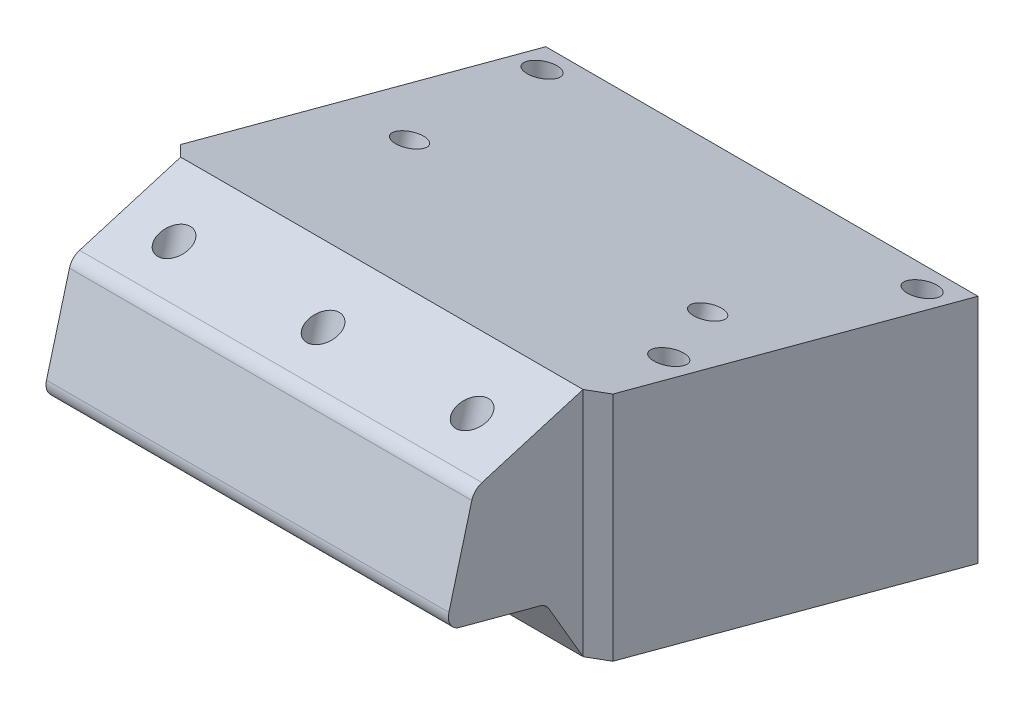
ISO-10303-21;
HEADER;
FILE_DESCRIPTION(('STEP AP214'),'2;1');
FILE_NAME('part.step','',(''),(''),'','','');
FILE_SCHEMA(('AUTOMOTIVE_DESIGN { 1 0 10303 214 1 1 1 1 }'));
ENDSEC;
DATA;
#1=APPLICATION_CONTEXT('core data for automotive mechanical design processes');
#2=APPLICATION_PROTOCOL_DEFINITION('international standard','automotive_design',2000,#1);
#3=PRODUCT_CONTEXT('',#1,'mechanical');
#4=PRODUCT('Part','Part','',(#3));
#5=PRODUCT_RELATED_PRODUCT_CATEGORY('part','',(#4));
#6=PRODUCT_DEFINITION_FORMATION('','',#4);
#7=PRODUCT_DEFINITION_CONTEXT('part definition',#1,'design');
#8=PRODUCT_DEFINITION('design','',#6,#7);
#9=PRODUCT_DEFINITION_SHAPE('','',#8);
#10=(LENGTH_UNIT() NAMED_UNIT(*) SI_UNIT(.MILLI.,.METRE.));
#11=(NAMED_UNIT(*) PLANE_ANGLE_UNIT() SI_UNIT($,.RADIAN.));
#12=(NAMED_UNIT(*) SI_UNIT($,.STERADIAN.) SOLID_ANGLE_UNIT());
#13=UNCERTAINTY_MEASURE_WITH_UNIT(LENGTH_MEASURE(1.E-05),#10,'distance_accuracy_value','');
#14=(GEOMETRIC_REPRESENTATION_CONTEXT(3) GLOBAL_UNCERTAINTY_ASSIGNED_CONTEXT((#13)) GLOBAL_UNIT_ASSIGNED_CONTEXT((#10,
#11,#12)) REPRESENTATION_CONTEXT('',''));
#15=CARTESIAN_POINT('',(0.,0.,0.));
#16=DIRECTION('',(0.,0.,1.));
#17=DIRECTION('',(1.,0.,0.));
#18=AXIS2_PLACEMENT_3D('',#15,#16,#17);
#19=CARTESIAN_POINT('',(132.287127209133,-48.0443614894541,0.));
#20=DIRECTION('',(0.,-0.965925826289068,0.258819045102521));
#21=DIRECTION('',(0.,-0.258819045102521,-0.965925826289068));
#22=AXIS2_PLACEMENT_3D('',#19,#20,#21);
#23=PLANE('',#22);
#24=CARTESIAN_POINT('',(25.5,-44.6949965840651,12.5));
#25=DIRECTION('',(0.,-0.965925826289068,0.258819045102521));
#26=DIRECTION('',(0.,-0.258819045102521,-0.965925826289068));
#27=AXIS2_PLACEMENT_3D('',#24,#25,#26);
#28=ELLIPSE('',#27,2.07055236082016,1.99999999999999);
#29=CARTESIAN_POINT('',(25.5,-45.2308949689273,10.5));
#30=VERTEX_POINT('',#29);
#31=EDGE_CURVE('E461',#30,#30,#28,.T.);
#32=ORIENTED_EDGE('',*,*,#31,.T.);
#33=EDGE_LOOP('',(#32));
#34=FACE_BOUND('',#33,.T.);
#35=CARTESIAN_POINT('',(25.5,-53.8052691267232,-21.5));
#36=DIRECTION('',(0.,-0.965925826289068,0.258819045102521));
#37=DIRECTION('',(0.,-0.258819045102521,-0.965925826289068));
#38=AXIS2_PLACEMENT_3D('',#35,#36,#37);
#39=ELLIPSE('',#38,2.07055236082015,1.99999999999999);
#40=CARTESIAN_POINT('',(25.5,-54.3411675115855,-23.5));
#41=VERTEX_POINT('',#40);
#42=EDGE_CURVE('E456',#41,#41,#39,.T.);
#43=ORIENTED_EDGE('',*,*,#42,.T.);
#44=EDGE_LOOP('',(#43));
#45=FACE_BOUND('',#44,.T.);
#46=CARTESIAN_POINT('',(-25.5,-53.8052691267232,-21.5));
#47=DIRECTION('',(0.,-0.965925826289068,0.258819045102521));
#48=DIRECTION('',(0.,-0.258819045102521,-0.965925826289068));
#49=AXIS2_PLACEMENT_3D('',#46,#47,#48);
#50=ELLIPSE('',#49,2.07055236082015,1.99999999999999);
#51=CARTESIAN_POINT('',(-25.5,-54.3411675115855,-23.5));
#52=VERTEX_POINT('',#51);
#53=EDGE_CURVE('E455',#52,#52,#50,.T.);
#54=ORIENTED_EDGE('',*,*,#53,.T.);
#55=EDGE_LOOP('',(#54));
#56=FACE_BOUND('',#55,.T.);
#57=CARTESIAN_POINT('',(-20.,-47.5654278723015,1.78740459266618));
#58=DIRECTION('',(0.,0.965925826289068,-0.258819045102521));
#59=DIRECTION('',(0.,0.258819045102521,0.965925826289068));
#60=AXIS2_PLACEMENT_3D('',#57,#58,#59);
#61=CIRCLE('',#60,1.94999999999999);
#62=CARTESIAN_POINT('',(-20.,-47.0607307343516,3.67095995392986));
#63=VERTEX_POINT('',#62);
#64=EDGE_CURVE('E161',#63,#63,#61,.T.);
#65=ORIENTED_EDGE('',*,*,#64,.F.);
#66=EDGE_LOOP('',(#65));
#67=FACE_BOUND('',#66,.T.);
#68=CARTESIAN_POINT('',(20.,-47.5654278723015,1.78740459266619));
#69=DIRECTION('',(0.,0.965925826289068,-0.258819045102521));
#70=DIRECTION('',(0.,0.258819045102521,0.965925826289068));
#71=AXIS2_PLACEMENT_3D('',#68,#69,#70);
#72=CIRCLE('',#71,1.94999999999999);
#73=CARTESIAN_POINT('',(20.,-47.0607307343516,3.67095995392986));
#74=VERTEX_POINT('',#73);
#75=EDGE_CURVE('E160',#74,#74,#72,.T.);
#76=ORIENTED_EDGE('',*,*,#75,.F.);
#77=EDGE_LOOP('',(#76));
#78=FACE_BOUND('',#77,.T.);
#79=DIRECTION('',(-1.,0.,0.));
#80=VECTOR('',#79,1.);
#81=CARTESIAN_POINT('',(27.,-41.2116570824605,25.5));
#82=LINE('',#81,#80);
#83=CARTESIAN_POINT('',(27.,-41.2116570824605,25.5));
#84=VERTEX_POINT('',#83);
#85=CARTESIAN_POINT('',(-27.,-41.2116570824605,25.5));
#86=VERTEX_POINT('',#85);
#87=EDGE_CURVE('E439',#84,#86,#82,.T.);
#88=ORIENTED_EDGE('',*,*,#87,.F.);
#89=DIRECTION('',(0.694746590606865,-0.186156787897386,-0.694746590606866));
#90=VECTOR('',#89,1.);
#91=CARTESIAN_POINT('',(34.603201838766,-43.2489288750486,17.896798161234));
#92=LINE('',#91,#90);
#93=CARTESIAN_POINT('',(29.,-41.7475554673227,23.5));
#94=VERTEX_POINT('',#93);
#95=EDGE_CURVE('E591',#84,#94,#92,.T.);
#96=ORIENTED_EDGE('',*,*,#95,.T.);
#97=DIRECTION('',(0.,-0.258819045102521,-0.965925826289068));
#98=VECTOR('',#97,1.);
#99=CARTESIAN_POINT('',(29.,-51.5247293347402,-12.9889096276365));
#100=LINE('',#99,#98);
#101=CARTESIAN_POINT('',(29.,-54.8770658964477,-25.5));
#102=VERTEX_POINT('',#101);
#103=EDGE_CURVE('E302',#94,#102,#100,.T.);
#104=ORIENTED_EDGE('',*,*,#103,.T.);
#105=DIRECTION('',(-1.,0.,0.));
#106=VECTOR('',#105,1.);
#107=CARTESIAN_POINT('',(132.287127209133,-54.8770658964478,-25.5));
#108=LINE('',#107,#106);
#109=CARTESIAN_POINT('',(-29.,-54.8770658964477,-25.5));
#110=VERTEX_POINT('',#109);
#111=EDGE_CURVE('E296',#102,#110,#108,.T.);
#112=ORIENTED_EDGE('',*,*,#111,.T.);
#113=DIRECTION('',(0.,0.258819045102521,0.965925826289068));
#114=VECTOR('',#113,1.);
#115=CARTESIAN_POINT('',(-29.,-48.0443614894541,0.));
#116=LINE('',#115,#114);
#117=CARTESIAN_POINT('',(-29.,-41.7475554673227,23.5));
#118=VERTEX_POINT('',#117);
#119=EDGE_CURVE('E303',#110,#118,#116,.T.);
#120=ORIENTED_EDGE('',*,*,#119,.T.);
#121=DIRECTION('',(-0.694746590606865,-0.186156787897386,-0.694746590606866));
#122=VECTOR('',#121,1.);
#123=CARTESIAN_POINT('',(-36.5338931394054,-43.7662560498888,15.9661068605946));
#124=LINE('',#123,#122);
#125=EDGE_CURVE('E561',#118,#86,#124,.F.);
#126=ORIENTED_EDGE('',*,*,#125,.T.);
#127=EDGE_LOOP('',(#88,#96,#104,#112,#120,#126));
#128=FACE_BOUND('',#127,.T.);
#129=ADVANCED_FACE('F54',(#34,#45,#56,#67,#78,#128),#23,.F.);
#130=CARTESIAN_POINT('',(132.287127209133,-79.1026469017566,0.));
#131=DIRECTION('',(0.,-0.965925826289068,0.258819045102521));
#132=DIRECTION('',(0.,-0.258819045102521,-0.965925826289068));
#133=AXIS2_PLACEMENT_3D('',#130,#131,#132);
#134=PLANE('',#133);
#135=CARTESIAN_POINT('',(25.5,-75.7532819963676,12.5));
#136=DIRECTION('',(0.,-0.965925826289068,0.258819045102521));
#137=DIRECTION('',(0.,-0.258819045102521,-0.965925826289068));
#138=AXIS2_PLACEMENT_3D('',#135,#136,#137);
#139=ELLIPSE('',#138,2.07055236082016,1.99999999999999);
#140=CARTESIAN_POINT('',(25.5,-76.2891803812298,10.5));
#141=VERTEX_POINT('',#140);
#142=EDGE_CURVE('E462',#141,#141,#139,.T.);
#143=ORIENTED_EDGE('',*,*,#142,.F.);
#144=EDGE_LOOP('',(#143));
#145=FACE_BOUND('',#144,.T.);
#146=CARTESIAN_POINT('',(25.5,-84.8635545390257,-21.5));
#147=DIRECTION('',(0.,-0.965925826289068,0.258819045102521));
#148=DIRECTION('',(0.,-0.258819045102521,-0.965925826289068));
#149=AXIS2_PLACEMENT_3D('',#146,#147,#148);
#150=ELLIPSE('',#149,2.07055236082015,1.99999999999999);
#151=CARTESIAN_POINT('',(25.5,-85.399452923888,-23.5));
#152=VERTEX_POINT('',#151);
#153=EDGE_CURVE('E457',#152,#152,#150,.T.);
#154=ORIENTED_EDGE('',*,*,#153,.F.);
#155=EDGE_LOOP('',(#154));
#156=FACE_BOUND('',#155,.T.);
#157=CARTESIAN_POINT('',(-25.5,-84.8635545390257,-21.5));
#158=DIRECTION('',(0.,-0.965925826289068,0.258819045102521));
#159=DIRECTION('',(0.,-0.258819045102521,-0.965925826289068));
#160=AXIS2_PLACEMENT_3D('',#157,#158,#159);
#161=ELLIPSE('',#160,2.07055236082015,1.99999999999999);
#162=CARTESIAN_POINT('',(-25.5,-85.399452923888,-23.5));
#163=VERTEX_POINT('',#162);
#164=EDGE_CURVE('E451',#163,#163,#161,.T.);
#165=ORIENTED_EDGE('',*,*,#164,.F.);
#166=EDGE_LOOP('',(#165));
#167=FACE_BOUND('',#166,.T.);
#168=CARTESIAN_POINT('',(0.,-82.0530656322124,-11.011112605664));
#169=DIRECTION('',(0.,-0.965925826289068,0.258819045102521));
#170=DIRECTION('',(0.,-0.258819045102521,-0.965925826289068));
#171=AXIS2_PLACEMENT_3D('',#168,#169,#170);
#172=CIRCLE('',#171,1.94999999999999);
#173=CARTESIAN_POINT('',(0.,-82.5577627701623,-12.8946679669277));
#174=VERTEX_POINT('',#173);
#175=EDGE_CURVE('E1063',#174,#174,#172,.T.);
#176=ORIENTED_EDGE('',*,*,#175,.F.);
#177=EDGE_LOOP('',(#176));
#178=FACE_BOUND('',#177,.T.);
#179=CARTESIAN_POINT('',(0.,-76.359046639957,10.2392555726955));
#180=DIRECTION('',(0.,-0.965925826289068,0.258819045102521));
#181=DIRECTION('',(0.,-0.258819045102521,-0.965925826289068));
#182=AXIS2_PLACEMENT_3D('',#179,#180,#181);
#183=CIRCLE('',#182,1.94999999999999);
#184=CARTESIAN_POINT('',(0.,-76.8637437779069,8.35570021143184));
#185=VERTEX_POINT('',#184);
#186=EDGE_CURVE('E1054',#185,#185,#183,.T.);
#187=ORIENTED_EDGE('',*,*,#186,.F.);
#188=EDGE_LOOP('',(#187));
#189=FACE_BOUND('',#188,.T.);
#190=DIRECTION('',(0.,-0.258819045102521,-0.965925826289068));
#191=VECTOR('',#190,1.);
#192=CARTESIAN_POINT('',(29.,-80.5025041234122,-5.22433827456085));
#193=LINE('',#192,#191);
#194=CARTESIAN_POINT('',(29.,-72.8058408796252,23.5));
#195=VERTEX_POINT('',#194);
#196=CARTESIAN_POINT('',(29.,-85.9353513087502,-25.5));
#197=VERTEX_POINT('',#196);
#198=EDGE_CURVE('E398',#195,#197,#193,.T.);
#199=ORIENTED_EDGE('',*,*,#198,.F.);
#200=DIRECTION('',(-0.694746590606865,0.186156787897386,0.694746590606866));
#201=VECTOR('',#200,1.);
#202=CARTESIAN_POINT('',(91.0110781014216,-89.4216591786845,-38.5110781014218));
#203=LINE('',#202,#201);
#204=CARTESIAN_POINT('',(27.,-72.269942494763,25.5));
#205=VERTEX_POINT('',#204);
#206=EDGE_CURVE('E394',#195,#205,#203,.T.);
#207=ORIENTED_EDGE('',*,*,#206,.T.);
#208=DIRECTION('',(-1.,0.,0.));
#209=VECTOR('',#208,1.);
#210=CARTESIAN_POINT('',(27.,-72.269942494763,25.5));
#211=LINE('',#210,#209);
#212=CARTESIAN_POINT('',(-27.,-72.269942494763,25.5));
#213=VERTEX_POINT('',#212);
#214=EDGE_CURVE('E399',#205,#213,#211,.T.);
#215=ORIENTED_EDGE('',*,*,#214,.T.);
#216=DIRECTION('',(0.694746590606865,0.186156787897386,0.694746590606866));
#217=VECTOR('',#216,1.);
#218=CARTESIAN_POINT('',(36.6917247432074,-55.2037962852752,89.1917247432074));
#219=LINE('',#218,#217);
#220=CARTESIAN_POINT('',(-29.,-72.8058408796252,23.5));
#221=VERTEX_POINT('',#220);
#222=EDGE_CURVE('E416',#213,#221,#219,.F.);
#223=ORIENTED_EDGE('',*,*,#222,.T.);
#224=DIRECTION('',(0.,0.258819045102521,0.965925826289068));
#225=VECTOR('',#224,1.);
#226=CARTESIAN_POINT('',(-29.,-79.1026469017566,0.));
#227=LINE('',#226,#225);
#228=CARTESIAN_POINT('',(-29.,-85.9353513087502,-25.5));
#229=VERTEX_POINT('',#228);
#230=EDGE_CURVE('E411',#229,#221,#227,.T.);
#231=ORIENTED_EDGE('',*,*,#230,.F.);
#232=DIRECTION('',(-1.,0.,0.));
#233=VECTOR('',#232,1.);
#234=CARTESIAN_POINT('',(132.287127209133,-85.9353513087503,-25.5));
#235=LINE('',#234,#233);
#236=EDGE_CURVE('E417',#197,#229,#235,.T.);
#237=ORIENTED_EDGE('',*,*,#236,.F.);
#238=EDGE_LOOP('',(#199,#207,#215,#223,#231,#237));
#239=FACE_BOUND('',#238,.T.);
#240=ADVANCED_FACE('F549',(#145,#156,#167,#178,#189,#239),#134,.T.);
#241=CARTESIAN_POINT('',(29.,-100.,0.));
#242=DIRECTION('',(1.,0.,0.));
#243=DIRECTION('',(0.,0.,-1.));
#244=AXIS2_PLACEMENT_3D('',#241,#242,#243);
#245=PLANE('',#244);
#246=ORIENTED_EDGE('',*,*,#103,.F.);
#247=DIRECTION('',(0.,-1.,0.));
#248=VECTOR('',#247,1.);
#249=CARTESIAN_POINT('',(29.,-72.269942494763,23.5));
#250=LINE('',#249,#248);
#251=EDGE_CURVE('E563',#94,#195,#250,.T.);
#252=ORIENTED_EDGE('',*,*,#251,.T.);
#253=ORIENTED_EDGE('',*,*,#198,.T.);
#254=DIRECTION('',(0.,1.,0.));
#255=VECTOR('',#254,1.);
#256=CARTESIAN_POINT('',(29.,-100.,-25.5));
#257=LINE('',#256,#255);
#258=EDGE_CURVE('E438',#102,#197,#257,.F.);
#259=ORIENTED_EDGE('',*,*,#258,.F.);
#260=EDGE_LOOP('',(#246,#252,#253,#259));
#261=FACE_BOUND('',#260,.T.);
#262=ADVANCED_FACE('F593',(#261),#245,.T.);
#263=CARTESIAN_POINT('',(0.,-100.,-25.5));
#264=DIRECTION('',(0.,0.,-1.));
#265=DIRECTION('',(-1.,0.,0.));
#266=AXIS2_PLACEMENT_3D('',#263,#264,#265);
#267=PLANE('',#266);
#268=ORIENTED_EDGE('',*,*,#111,.F.);
#269=ORIENTED_EDGE('',*,*,#258,.T.);
#270=ORIENTED_EDGE('',*,*,#236,.T.);
#271=DIRECTION('',(0.,-1.,0.));
#272=VECTOR('',#271,1.);
#273=CARTESIAN_POINT('',(-29.,-100.,-25.5));
#274=LINE('',#273,#272);
#275=EDGE_CURVE('E432',#110,#229,#274,.T.);
#276=ORIENTED_EDGE('',*,*,#275,.F.);
#277=EDGE_LOOP('',(#268,#269,#270,#276));
#278=FACE_BOUND('',#277,.T.);
#279=ADVANCED_FACE('F578',(#278),#267,.T.);
#280=CARTESIAN_POINT('',(-29.,-100.,0.));
#281=DIRECTION('',(1.,0.,0.));
#282=DIRECTION('',(0.,0.,-1.));
#283=AXIS2_PLACEMENT_3D('',#280,#281,#282);
#284=PLANE('',#283);
#285=ORIENTED_EDGE('',*,*,#230,.T.);
#286=DIRECTION('',(0.,1.,0.));
#287=VECTOR('',#286,1.);
#288=CARTESIAN_POINT('',(-29.,-100.,23.5));
#289=LINE('',#288,#287);
#290=EDGE_CURVE('E206',#221,#118,#289,.T.);
#291=ORIENTED_EDGE('',*,*,#290,.T.);
#292=ORIENTED_EDGE('',*,*,#119,.F.);
#293=ORIENTED_EDGE('',*,*,#275,.T.);
#294=EDGE_LOOP('',(#285,#291,#292,#293));
#295=FACE_BOUND('',#294,.T.);
#296=ADVANCED_FACE('F556',(#295),#284,.F.);
#297=CARTESIAN_POINT('',(27.,-67.9766028822499,28.));
#298=DIRECTION('',(0.,-0.503202863969206,0.864168315603615));
#299=DIRECTION('',(0.,-0.864168315603615,-0.503202863969206));
#300=AXIS2_PLACEMENT_3D('',#297,#298,#299);
#301=PLANE('',#300);
#302=DIRECTION('',(0.,0.864168315603615,0.503202863969206));
#303=VECTOR('',#302,1.);
#304=CARTESIAN_POINT('',(27.,-67.9766028822499,28.));
#305=LINE('',#304,#303);
#306=CARTESIAN_POINT('',(27.,-64.395418253721,30.0853140863184));
#307=VERTEX_POINT('',#306);
#308=EDGE_CURVE('E198',#205,#307,#305,.T.);
#309=ORIENTED_EDGE('',*,*,#308,.T.);
#310=DIRECTION('',(-1.,0.,0.));
#311=VECTOR('',#310,1.);
#312=CARTESIAN_POINT('',(-27.,-64.395418253721,30.0853140863184));
#313=LINE('',#312,#311);
#314=CARTESIAN_POINT('',(-27.,-64.395418253721,30.0853140863184));
#315=VERTEX_POINT('',#314);
#316=EDGE_CURVE('E489',#307,#315,#313,.T.);
#317=ORIENTED_EDGE('',*,*,#316,.T.);
#318=DIRECTION('',(0.,0.864168315603615,0.503202863969206));
#319=VECTOR('',#318,1.);
#320=CARTESIAN_POINT('',(-27.,-67.9766028822499,28.));
#321=LINE('',#320,#319);
#322=EDGE_CURVE('E193',#213,#315,#321,.T.);
#323=ORIENTED_EDGE('',*,*,#322,.F.);
#324=ORIENTED_EDGE('',*,*,#214,.F.);
#325=EDGE_LOOP('',(#309,#317,#323,#324));
#326=FACE_BOUND('',#325,.T.);
#327=ADVANCED_FACE('F541',(#326),#301,.T.);
#328=CARTESIAN_POINT('',(27.,-61.8715299540191,37.2614807840235));
#329=DIRECTION('',(0.,-0.965925826289068,0.258819045102521));
#330=DIRECTION('',(0.,-0.258819045102521,-0.965925826289068));
#331=AXIS2_PLACEMENT_3D('',#328,#329,#330);
#332=PLANE('',#331);
#333=CARTESIAN_POINT('',(0.,-61.6127109089166,38.2274066103125));
#334=DIRECTION('',(0.,-0.965925826289068,0.258819045102521));
#335=DIRECTION('',(0.,-0.258819045102521,-0.965925826289068));
#336=AXIS2_PLACEMENT_3D('',#333,#334,#335);
#337=CIRCLE('',#336,2.99999999999996);
#338=CARTESIAN_POINT('',(0.,-62.3891680442241,35.3296291314454));
#339=VERTEX_POINT('',#338);
#340=EDGE_CURVE('E477',#339,#339,#337,.F.);
#341=ORIENTED_EDGE('',*,*,#340,.T.);
#342=EDGE_LOOP('',(#341));
#343=FACE_BOUND('',#342,.T.);
#344=CARTESIAN_POINT('',(-20.,-61.6127109089166,38.2274066103125));
#345=DIRECTION('',(0.,-0.965925826289068,0.258819045102521));
#346=DIRECTION('',(0.,-0.258819045102521,-0.965925826289068));
#347=AXIS2_PLACEMENT_3D('',#344,#345,#346);
#348=CIRCLE('',#347,2.99999999999995);
#349=CARTESIAN_POINT('',(-20.,-62.3891680442241,35.3296291314454));
#350=VERTEX_POINT('',#349);
#351=EDGE_CURVE('E473',#350,#350,#348,.F.);
#352=ORIENTED_EDGE('',*,*,#351,.T.);
#353=EDGE_LOOP('',(#352));
#354=FACE_BOUND('',#353,.T.);
#355=CARTESIAN_POINT('',(20.,-61.6127109089166,38.2274066103125));
#356=DIRECTION('',(0.,-0.965925826289068,0.258819045102521));
#357=DIRECTION('',(0.,-0.258819045102521,-0.965925826289068));
#358=AXIS2_PLACEMENT_3D('',#355,#356,#357);
#359=CIRCLE('',#358,2.99999999999995);
#360=CARTESIAN_POINT('',(20.,-62.3891680442241,35.3296291314454));
#361=VERTEX_POINT('',#360);
#362=EDGE_CURVE('E469',#361,#361,#359,.F.);
#363=ORIENTED_EDGE('',*,*,#362,.T.);
#364=EDGE_LOOP('',(#363));
#365=FACE_BOUND('',#364,.T.);
#366=DIRECTION('',(0.,0.258819045102521,0.965925826289068));
#367=VECTOR('',#366,1.);
#368=CARTESIAN_POINT('',(-27.,-61.8715299540191,37.2614807840235));
#369=LINE('',#368,#367);
#370=CARTESIAN_POINT('',(-27.,-63.4699723290812,31.2960126273206));
#371=VERTEX_POINT('',#370);
#372=CARTESIAN_POINT('',(-27.,-60.5774347285065,42.0911099154688));
#373=VERTEX_POINT('',#372);
#374=EDGE_CURVE('E199',#371,#373,#369,.T.);
#375=ORIENTED_EDGE('',*,*,#374,.F.);
#376=DIRECTION('',(-1.,0.,0.));
#377=VECTOR('',#376,1.);
#378=CARTESIAN_POINT('',(27.,-63.4699723290812,31.2960126273206));
#379=LINE('',#378,#377);
#380=CARTESIAN_POINT('',(27.,-63.4699723290812,31.2960126273206));
#381=VERTEX_POINT('',#380);
#382=EDGE_CURVE('E496',#371,#381,#379,.F.);
#383=ORIENTED_EDGE('',*,*,#382,.T.);
#384=DIRECTION('',(0.,0.258819045102521,0.965925826289068));
#385=VECTOR('',#384,1.);
#386=CARTESIAN_POINT('',(27.,-61.8715299540191,37.2614807840235));
#387=LINE('',#386,#385);
#388=CARTESIAN_POINT('',(27.,-60.5774347285065,42.0911099154688));
#389=VERTEX_POINT('',#388);
#390=EDGE_CURVE('E218',#381,#389,#387,.T.);
#391=ORIENTED_EDGE('',*,*,#390,.T.);
#392=DIRECTION('',(1.,0.,0.));
#393=VECTOR('',#392,1.);
#394=CARTESIAN_POINT('',(-27.,-60.5774347285065,42.0911099154688));
#395=LINE('',#394,#393);
#396=EDGE_CURVE('E493',#389,#373,#395,.F.);
#397=ORIENTED_EDGE('',*,*,#396,.T.);
#398=EDGE_LOOP('',(#375,#383,#391,#397));
#399=FACE_BOUND('',#398,.T.);
#400=ADVANCED_FACE('F527',(#343,#354,#365,#399),#332,.T.);
#401=CARTESIAN_POINT('',(27.,-52.8153529411335,42.081818729778));
#402=DIRECTION('',(0.,-0.258819045102521,-0.965925826289068));
#403=DIRECTION('',(0.,0.965925826289068,-0.258819045102521));
#404=AXIS2_PLACEMENT_3D('',#401,#402,#403);
#405=PLANE('',#404);
#406=DIRECTION('',(0.,-0.965925826289068,0.258819045102521));
#407=VECTOR('',#406,1.);
#408=CARTESIAN_POINT('',(27.,-54.6477602239948,42.5728107814256));
#409=LINE('',#408,#407);
#410=CARTESIAN_POINT('',(27.,-58.1279449857233,43.5053234778419));
#411=VERTEX_POINT('',#410);
#412=CARTESIAN_POINT('',(27.,-46.6510079757283,40.4300874744309));
#413=VERTEX_POINT('',#412);
#414=EDGE_CURVE('E447',#411,#413,#409,.F.);
#415=ORIENTED_EDGE('',*,*,#414,.T.);
#416=DIRECTION('',(1.,0.,0.));
#417=VECTOR('',#416,1.);
#418=CARTESIAN_POINT('',(-27.,-46.6510079757283,40.4300874744309));
#419=LINE('',#418,#417);
#420=CARTESIAN_POINT('',(-27.,-46.6510079757283,40.4300874744309));
#421=VERTEX_POINT('',#420);
#422=EDGE_CURVE('E70',#413,#421,#419,.F.);
#423=ORIENTED_EDGE('',*,*,#422,.T.);
#424=DIRECTION('',(0.,0.965925826289068,-0.258819045102521));
#425=VECTOR('',#424,1.);
#426=CARTESIAN_POINT('',(-27.,-52.8153529411335,42.081818729778));
#427=LINE('',#426,#425);
#428=CARTESIAN_POINT('',(-27.,-58.1279449857233,43.5053234778419));
#429=VERTEX_POINT('',#428);
#430=EDGE_CURVE('E443',#429,#421,#427,.T.);
#431=ORIENTED_EDGE('',*,*,#430,.F.);
#432=DIRECTION('',(1.,0.,0.));
#433=VECTOR('',#432,1.);
#434=CARTESIAN_POINT('',(27.,-58.1279449857233,43.5053234778419));
#435=LINE('',#434,#433);
#436=EDGE_CURVE('E509',#429,#411,#435,.T.);
#437=ORIENTED_EDGE('',*,*,#436,.T.);
#438=EDGE_LOOP('',(#415,#423,#431,#437));
#439=FACE_BOUND('',#438,.T.);
#440=ADVANCED_FACE('F740',(#439),#405,.F.);
#441=CARTESIAN_POINT('',(27.,-43.391283163213,32.8203379457546));
#442=DIRECTION('',(0.,0.958417920293571,0.285368341026377));
#443=DIRECTION('',(0.,-0.285368341026377,0.958417920293571));
#444=AXIS2_PLACEMENT_3D('',#441,#442,#443);
#445=PLANE('',#444);
#446=CARTESIAN_POINT('',(20.,-43.5610415274754,33.3904763775217));
#447=DIRECTION('',(0.,0.958417920293571,0.285368341026377));
#448=DIRECTION('',(0.,-0.285368341026377,0.958417920293571));
#449=AXIS2_PLACEMENT_3D('',#446,#447,#448);
#450=ELLIPSE('',#449,2.28899605860239,1.94999999999997);
#451=CARTESIAN_POINT('',(20.,-44.2142485353346,35.5842912195676));
#452=VERTEX_POINT('',#451);
#453=EDGE_CURVE('E1075',#452,#452,#450,.T.);
#454=ORIENTED_EDGE('',*,*,#453,.F.);
#455=EDGE_LOOP('',(#454));
#456=FACE_BOUND('',#455,.T.);
#457=CARTESIAN_POINT('',(0.,-43.5610415274754,33.3904763775217));
#458=DIRECTION('',(0.,0.958417920293571,0.285368341026377));
#459=DIRECTION('',(0.,-0.285368341026377,0.958417920293571));
#460=AXIS2_PLACEMENT_3D('',#457,#458,#459);
#461=ELLIPSE('',#460,2.28899605860239,1.94999999999998);
#462=CARTESIAN_POINT('',(0.,-44.2142485353346,35.5842912195676));
#463=VERTEX_POINT('',#462);
#464=EDGE_CURVE('E1071',#463,#463,#461,.T.);
#465=ORIENTED_EDGE('',*,*,#464,.F.);
#466=EDGE_LOOP('',(#465));
#467=FACE_BOUND('',#466,.T.);
#468=CARTESIAN_POINT('',(-20.,-43.5610415274754,33.3904763775217));
#469=DIRECTION('',(0.,0.958417920293571,0.285368341026377));
#470=DIRECTION('',(0.,-0.285368341026377,0.958417920293571));
#471=AXIS2_PLACEMENT_3D('',#468,#469,#470);
#472=ELLIPSE('',#471,2.28899605860239,1.94999999999997);
#473=CARTESIAN_POINT('',(-20.,-44.2142485353346,35.5842912195676));
#474=VERTEX_POINT('',#473);
#475=EDGE_CURVE('E1067',#474,#474,#472,.T.);
#476=ORIENTED_EDGE('',*,*,#475,.F.);
#477=EDGE_LOOP('',(#476));
#478=FACE_BOUND('',#477,.T.);
#479=DIRECTION('',(0.,0.285368341026377,-0.958417920293571));
#480=VECTOR('',#479,1.);
#481=CARTESIAN_POINT('',(-27.,-43.391283163213,32.8203379457546));
#482=LINE('',#481,#480);
#483=CARTESIAN_POINT('',(-27.,-45.2518102253462,39.0689725039055));
#484=VERTEX_POINT('',#483);
#485=EDGE_CURVE('E226',#484,#86,#482,.T.);
#486=ORIENTED_EDGE('',*,*,#485,.F.);
#487=DIRECTION('',(1.,0.,0.));
#488=VECTOR('',#487,1.);
#489=CARTESIAN_POINT('',(27.,-45.2518102253462,39.0689725039055));
#490=LINE('',#489,#488);
#491=CARTESIAN_POINT('',(27.,-45.2518102253462,39.0689725039055));
#492=VERTEX_POINT('',#491);
#493=EDGE_CURVE('E499',#484,#492,#490,.T.);
#494=ORIENTED_EDGE('',*,*,#493,.T.);
#495=DIRECTION('',(0.,0.285368341026377,-0.958417920293571));
#496=VECTOR('',#495,1.);
#497=CARTESIAN_POINT('',(27.,-43.391283163213,32.8203379457546));
#498=LINE('',#497,#496);
#499=EDGE_CURVE('E223',#492,#84,#498,.T.);
#500=ORIENTED_EDGE('',*,*,#499,.T.);
#501=ORIENTED_EDGE('',*,*,#87,.T.);
#502=EDGE_LOOP('',(#486,#494,#500,#501));
#503=FACE_BOUND('',#502,.T.);
#504=ADVANCED_FACE('F647',(#456,#467,#478,#503),#445,.T.);
#505=CARTESIAN_POINT('',(27.,-56.7407997886117,34.7614807840235));
#506=DIRECTION('',(-1.,0.,0.));
#507=DIRECTION('',(0.,-1.,0.));
#508=AXIS2_PLACEMENT_3D('',#505,#506,#507);
#509=PLANE('',#508);
#510=ORIENTED_EDGE('',*,*,#499,.F.);
#511=CARTESIAN_POINT('',(27.,-47.1686460659333,38.4982358218527));
#512=DIRECTION('',(-1.,0.,0.));
#513=DIRECTION('',(0.,0.,1.));
#514=AXIS2_PLACEMENT_3D('',#511,#512,#513);
#515=CIRCLE('',#514,2.);
#516=EDGE_CURVE('E506',#492,#413,#515,.F.);
#517=ORIENTED_EDGE('',*,*,#516,.T.);
#518=ORIENTED_EDGE('',*,*,#414,.F.);
#519=CARTESIAN_POINT('',(27.,-58.6455830759284,41.5734718252638));
#520=DIRECTION('',(-1.,0.,0.));
#521=DIRECTION('',(0.,0.,1.));
#522=AXIS2_PLACEMENT_3D('',#519,#520,#521);
#523=CIRCLE('',#522,2.);
#524=EDGE_CURVE('E503',#411,#389,#523,.F.);
#525=ORIENTED_EDGE('',*,*,#524,.T.);
#526=ORIENTED_EDGE('',*,*,#390,.F.);
#527=CARTESIAN_POINT('',(27.,-65.4018239816594,31.8136507175256));
#528=DIRECTION('',(-1.,0.,0.));
#529=DIRECTION('',(0.,0.,1.));
#530=AXIS2_PLACEMENT_3D('',#527,#528,#529);
#531=CIRCLE('',#530,2.);
#532=EDGE_CURVE('E12',#381,#307,#531,.T.);
#533=ORIENTED_EDGE('',*,*,#532,.T.);
#534=ORIENTED_EDGE('',*,*,#308,.F.);
#535=DIRECTION('',(0.,-1.,0.));
#536=VECTOR('',#535,1.);
#537=CARTESIAN_POINT('',(27.,-56.7407997886118,25.5));
#538=LINE('',#537,#536);
#539=EDGE_CURVE('E181',#84,#205,#538,.T.);
#540=ORIENTED_EDGE('',*,*,#539,.F.);
#541=EDGE_LOOP('',(#510,#517,#518,#525,#526,#533,#534,#540));
#542=FACE_BOUND('',#541,.T.);
#543=ADVANCED_FACE('F536',(#542),#509,.F.);
#544=CARTESIAN_POINT('',(-27.,-56.7407997886117,34.7614807840235));
#545=DIRECTION('',(-1.,0.,0.));
#546=DIRECTION('',(0.,-1.,0.));
#547=AXIS2_PLACEMENT_3D('',#544,#545,#546);
#548=PLANE('',#547);
#549=ORIENTED_EDGE('',*,*,#430,.T.);
#550=CARTESIAN_POINT('',(-27.,-47.1686460659333,38.4982358218527));
#551=DIRECTION('',(-1.,0.,0.));
#552=DIRECTION('',(0.,0.,1.));
#553=AXIS2_PLACEMENT_3D('',#550,#551,#552);
#554=CIRCLE('',#553,2.);
#555=EDGE_CURVE('E517',#421,#484,#554,.T.);
#556=ORIENTED_EDGE('',*,*,#555,.T.);
#557=ORIENTED_EDGE('',*,*,#485,.T.);
#558=DIRECTION('',(0.,-1.,0.));
#559=VECTOR('',#558,1.);
#560=CARTESIAN_POINT('',(-27.,-56.7407997886118,25.5));
#561=LINE('',#560,#559);
#562=EDGE_CURVE('E176',#86,#213,#561,.T.);
#563=ORIENTED_EDGE('',*,*,#562,.T.);
#564=ORIENTED_EDGE('',*,*,#322,.T.);
#565=CARTESIAN_POINT('',(-27.,-65.4018239816594,31.8136507175256));
#566=DIRECTION('',(-1.,0.,0.));
#567=DIRECTION('',(0.,0.,1.));
#568=AXIS2_PLACEMENT_3D('',#565,#566,#567);
#569=CIRCLE('',#568,2.);
#570=EDGE_CURVE('E63',#315,#371,#569,.F.);
#571=ORIENTED_EDGE('',*,*,#570,.T.);
#572=ORIENTED_EDGE('',*,*,#374,.T.);
#573=CARTESIAN_POINT('',(-27.,-58.6455830759284,41.5734718252638));
#574=DIRECTION('',(-1.,0.,0.));
#575=DIRECTION('',(0.,0.,1.));
#576=AXIS2_PLACEMENT_3D('',#573,#574,#575);
#577=CIRCLE('',#576,2.);
#578=EDGE_CURVE('E77',#373,#429,#577,.T.);
#579=ORIENTED_EDGE('',*,*,#578,.T.);
#580=EDGE_LOOP('',(#549,#556,#557,#563,#564,#571,#572,#579));
#581=FACE_BOUND('',#580,.T.);
#582=ADVANCED_FACE('F521',(#581),#548,.T.);
#583=CARTESIAN_POINT('',(27.,-100.,25.5));
#584=DIRECTION('',(0.707106781186548,0.,0.707106781186547));
#585=DIRECTION('',(0.,-1.,0.));
#586=AXIS2_PLACEMENT_3D('',#583,#584,#585);
#587=PLANE('',#586);
#588=ORIENTED_EDGE('',*,*,#206,.F.);
#589=ORIENTED_EDGE('',*,*,#251,.F.);
#590=ORIENTED_EDGE('',*,*,#95,.F.);
#591=ORIENTED_EDGE('',*,*,#539,.T.);
#592=EDGE_LOOP('',(#588,#589,#590,#591));
#593=FACE_BOUND('',#592,.T.);
#594=ADVANCED_FACE('F653',(#593),#587,.T.);
#595=CARTESIAN_POINT('',(-29.,-100.,23.5));
#596=DIRECTION('',(0.707106781186548,0.,-0.707106781186547));
#597=DIRECTION('',(0.,1.,0.));
#598=AXIS2_PLACEMENT_3D('',#595,#596,#597);
#599=PLANE('',#598);
#600=ORIENTED_EDGE('',*,*,#222,.F.);
#601=ORIENTED_EDGE('',*,*,#562,.F.);
#602=ORIENTED_EDGE('',*,*,#125,.F.);
#603=ORIENTED_EDGE('',*,*,#290,.F.);
#604=EDGE_LOOP('',(#600,#601,#602,#603));
#605=FACE_BOUND('',#604,.T.);
#606=ADVANCED_FACE('F559',(#605),#599,.F.);
#607=CARTESIAN_POINT('',(20.,-66.8839443980829,6.96378549471661));
#608=DIRECTION('',(0.,0.965925826289068,-0.258819045102521));
#609=DIRECTION('',(0.,0.258819045102521,0.965925826289068));
#610=AXIS2_PLACEMENT_3D('',#607,#608,#609);
#611=CONICAL_SURFACE('',#610,1.94999999999998,1.02974425867665);
#612=CARTESIAN_POINT('',(20.,-68.0156986384245,7.26703812944664));
#613=VERTEX_POINT('',#612);
#614=VERTEX_LOOP('',#613);
#615=FACE_BOUND('',#614,.T.);
#616=CARTESIAN_POINT('',(20.,-66.8839443980829,6.96378549471661));
#617=DIRECTION('',(0.,0.965925826289068,-0.258819045102521));
#618=DIRECTION('',(0.,0.258819045102521,0.965925826289068));
#619=AXIS2_PLACEMENT_3D('',#616,#617,#618);
#620=CIRCLE('',#619,1.94999999999998);
#621=CARTESIAN_POINT('',(20.,-66.379247260133,8.84734085598028));
#622=VERTEX_POINT('',#621);
#623=EDGE_CURVE('E166',#622,#622,#620,.T.);
#624=ORIENTED_EDGE('',*,*,#623,.T.);
#625=EDGE_LOOP('',(#624));
#626=FACE_BOUND('',#625,.T.);
#627=ADVANCED_FACE('F698',(#615,#626),#611,.F.);
#628=CARTESIAN_POINT('',(20.,-47.5654278723015,1.78740459266619));
#629=DIRECTION('',(0.,0.965925826289068,-0.258819045102521));
#630=DIRECTION('',(0.,0.258819045102521,0.965925826289068));
#631=AXIS2_PLACEMENT_3D('',#628,#629,#630);
#632=CYLINDRICAL_SURFACE('',#631,1.94999999999999);
#633=ORIENTED_EDGE('',*,*,#623,.F.);
#634=EDGE_LOOP('',(#633));
#635=FACE_BOUND('',#634,.T.);
#636=ORIENTED_EDGE('',*,*,#75,.T.);
#637=EDGE_LOOP('',(#636));
#638=FACE_BOUND('',#637,.T.);
#639=ADVANCED_FACE('F153',(#635,#638),#632,.F.);
#640=CARTESIAN_POINT('',(-20.,-66.8839443980829,6.96378549471661));
#641=DIRECTION('',(0.,0.965925826289068,-0.258819045102521));
#642=DIRECTION('',(0.,0.258819045102521,0.965925826289068));
#643=AXIS2_PLACEMENT_3D('',#640,#641,#642);
#644=CONICAL_SURFACE('',#643,1.94999999999998,1.02974425867665);
#645=CARTESIAN_POINT('',(-20.,-68.0156986384245,7.26703812944664));
#646=VERTEX_POINT('',#645);
#647=VERTEX_LOOP('',#646);
#648=FACE_BOUND('',#647,.T.);
#649=CARTESIAN_POINT('',(-20.,-66.8839443980829,6.96378549471661));
#650=DIRECTION('',(0.,0.965925826289068,-0.258819045102521));
#651=DIRECTION('',(0.,0.258819045102521,0.965925826289068));
#652=AXIS2_PLACEMENT_3D('',#649,#650,#651);
#653=CIRCLE('',#652,1.94999999999998);
#654=CARTESIAN_POINT('',(-20.,-66.379247260133,8.84734085598028));
#655=VERTEX_POINT('',#654);
#656=EDGE_CURVE('E157',#655,#655,#653,.T.);
#657=ORIENTED_EDGE('',*,*,#656,.T.);
#658=EDGE_LOOP('',(#657));
#659=FACE_BOUND('',#658,.T.);
#660=ADVANCED_FACE('F149',(#648,#659),#644,.F.);
#661=CARTESIAN_POINT('',(-20.,-47.5654278723015,1.78740459266618));
#662=DIRECTION('',(0.,0.965925826289068,-0.258819045102521));
#663=DIRECTION('',(0.,0.258819045102521,0.965925826289068));
#664=AXIS2_PLACEMENT_3D('',#661,#662,#663);
#665=CYLINDRICAL_SURFACE('',#664,1.94999999999999);
#666=ORIENTED_EDGE('',*,*,#656,.F.);
#667=EDGE_LOOP('',(#666));
#668=FACE_BOUND('',#667,.T.);
#669=ORIENTED_EDGE('',*,*,#64,.T.);
#670=EDGE_LOOP('',(#669));
#671=FACE_BOUND('',#670,.T.);
#672=ADVANCED_FACE('F152',(#668,#671),#665,.F.);
#673=CARTESIAN_POINT('',(0.,-52.2109009827303,3.76877944513248));
#674=DIRECTION('',(0.,0.965925826289068,-0.258819045102521));
#675=DIRECTION('',(0.,0.258819045102521,0.965925826289068));
#676=AXIS2_PLACEMENT_3D('',#673,#674,#675);
#677=PLANE('',#676);
#678=CARTESIAN_POINT('',(0.,-52.2109009827303,3.76877944513248));
#679=DIRECTION('',(0.,-0.965925826289068,0.258819045102521));
#680=DIRECTION('',(0.,-0.258819045102521,-0.965925826289068));
#681=AXIS2_PLACEMENT_3D('',#678,#679,#680);
#682=CIRCLE('',#681,1.94999999999999);
#683=CARTESIAN_POINT('',(0.,-52.7155981206802,1.88522408386881));
#684=VERTEX_POINT('',#683);
#685=EDGE_CURVE('E169',#684,#684,#682,.T.);
#686=ORIENTED_EDGE('',*,*,#685,.T.);
#687=EDGE_LOOP('',(#686));
#688=FACE_BOUND('',#687,.T.);
#689=ADVANCED_FACE('F971',(#688),#677,.F.);
#690=CARTESIAN_POINT('',(0.,-76.359046639957,10.2392555726955));
#691=DIRECTION('',(0.,-0.965925826289068,0.258819045102521));
#692=DIRECTION('',(0.,-0.258819045102521,-0.965925826289068));
#693=AXIS2_PLACEMENT_3D('',#690,#691,#692);
#694=CYLINDRICAL_SURFACE('',#693,1.94999999999999);
#695=ORIENTED_EDGE('',*,*,#685,.F.);
#696=EDGE_LOOP('',(#695));
#697=FACE_BOUND('',#696,.T.);
#698=ORIENTED_EDGE('',*,*,#186,.T.);
#699=EDGE_LOOP('',(#698));
#700=FACE_BOUND('',#699,.T.);
#701=ADVANCED_FACE('F961',(#697,#700),#694,.F.);
#702=CARTESIAN_POINT('',(0.,-57.9049199749857,-17.481588733227));
#703=DIRECTION('',(0.,0.965925826289068,-0.258819045102521));
#704=DIRECTION('',(0.,0.258819045102521,0.965925826289068));
#705=AXIS2_PLACEMENT_3D('',#702,#703,#704);
#706=PLANE('',#705);
#707=CARTESIAN_POINT('',(0.,-57.9049199749857,-17.481588733227));
#708=DIRECTION('',(0.,-0.965925826289068,0.258819045102521));
#709=DIRECTION('',(0.,-0.258819045102521,-0.965925826289068));
#710=AXIS2_PLACEMENT_3D('',#707,#708,#709);
#711=CIRCLE('',#710,1.94999999999999);
#712=CARTESIAN_POINT('',(0.,-58.4096171129356,-19.3651440944907));
#713=VERTEX_POINT('',#712);
#714=EDGE_CURVE('E1057',#713,#713,#711,.T.);
#715=ORIENTED_EDGE('',*,*,#714,.T.);
#716=EDGE_LOOP('',(#715));
#717=FACE_BOUND('',#716,.T.);
#718=ADVANCED_FACE('F951',(#717),#706,.F.);
#719=CARTESIAN_POINT('',(0.,-82.0530656322124,-11.011112605664));
#720=DIRECTION('',(0.,-0.965925826289068,0.258819045102521));
#721=DIRECTION('',(0.,-0.258819045102521,-0.965925826289068));
#722=AXIS2_PLACEMENT_3D('',#719,#720,#721);
#723=CYLINDRICAL_SURFACE('',#722,1.94999999999999);
#724=ORIENTED_EDGE('',*,*,#714,.F.);
#725=EDGE_LOOP('',(#724));
#726=FACE_BOUND('',#725,.T.);
#727=ORIENTED_EDGE('',*,*,#175,.T.);
#728=EDGE_LOOP('',(#727));
#729=FACE_BOUND('',#728,.T.);
#730=ADVANCED_FACE('F842',(#726,#729),#723,.F.);
#731=CARTESIAN_POINT('',(-20.,-61.6127109089166,38.2274066103125));
#732=DIRECTION('',(0.,-0.965925826289068,0.258819045102521));
#733=DIRECTION('',(0.,-0.258819045102521,-0.965925826289068));
#734=AXIS2_PLACEMENT_3D('',#731,#732,#733);
#735=CYLINDRICAL_SURFACE('',#734,1.94999999999997);
#736=CARTESIAN_POINT('',(-20.,-59.8560266710672,37.7567044874243));
#737=DIRECTION('',(0.,-0.965925826289068,0.258819045102521));
#738=DIRECTION('',(0.,-0.258819045102521,-0.965925826289068));
#739=AXIS2_PLACEMENT_3D('',#736,#737,#738);
#740=CIRCLE('',#739,1.94999999999997);
#741=CARTESIAN_POINT('',(-20.,-60.3607238090171,35.8731491261606));
#742=VERTEX_POINT('',#741);
#743=EDGE_CURVE('E481',#742,#742,#740,.T.);
#744=ORIENTED_EDGE('',*,*,#743,.T.);
#745=EDGE_LOOP('',(#744));
#746=FACE_BOUND('',#745,.T.);
#747=ORIENTED_EDGE('',*,*,#475,.T.);
#748=EDGE_LOOP('',(#747));
#749=FACE_BOUND('',#748,.T.);
#750=ADVANCED_FACE('F836',(#746,#749),#735,.F.);
#751=CARTESIAN_POINT('',(0.,-61.6127109089166,38.2274066103125));
#752=DIRECTION('',(0.,-0.965925826289068,0.258819045102521));
#753=DIRECTION('',(0.,-0.258819045102521,-0.965925826289068));
#754=AXIS2_PLACEMENT_3D('',#751,#752,#753);
#755=CYLINDRICAL_SURFACE('',#754,1.94999999999998);
#756=CARTESIAN_POINT('',(0.,-59.8560266710672,37.7567044874243));
#757=DIRECTION('',(0.,-0.965925826289068,0.258819045102521));
#758=DIRECTION('',(0.,-0.258819045102521,-0.965925826289068));
#759=AXIS2_PLACEMENT_3D('',#756,#757,#758);
#760=CIRCLE('',#759,1.94999999999998);
#761=CARTESIAN_POINT('',(0.,-60.3607238090171,35.8731491261606));
#762=VERTEX_POINT('',#761);
#763=EDGE_CURVE('E450',#762,#762,#760,.T.);
#764=ORIENTED_EDGE('',*,*,#763,.T.);
#765=EDGE_LOOP('',(#764));
#766=FACE_BOUND('',#765,.T.);
#767=ORIENTED_EDGE('',*,*,#464,.T.);
#768=EDGE_LOOP('',(#767));
#769=FACE_BOUND('',#768,.T.);
#770=ADVANCED_FACE('F841',(#766,#769),#755,.F.);
#771=CARTESIAN_POINT('',(20.,-61.6127109089166,38.2274066103125));
#772=DIRECTION('',(0.,-0.965925826289068,0.258819045102521));
#773=DIRECTION('',(0.,-0.258819045102521,-0.965925826289068));
#774=AXIS2_PLACEMENT_3D('',#771,#772,#773);
#775=CYLINDRICAL_SURFACE('',#774,1.94999999999997);
#776=CARTESIAN_POINT('',(20.,-59.8560266710672,37.7567044874243));
#777=DIRECTION('',(0.,-0.965925826289068,0.258819045102521));
#778=DIRECTION('',(0.,-0.258819045102521,-0.965925826289068));
#779=AXIS2_PLACEMENT_3D('',#776,#777,#778);
#780=CIRCLE('',#779,1.94999999999997);
#781=CARTESIAN_POINT('',(20.,-60.3607238090171,35.8731491261606));
#782=VERTEX_POINT('',#781);
#783=EDGE_CURVE('E485',#782,#782,#780,.T.);
#784=ORIENTED_EDGE('',*,*,#783,.T.);
#785=EDGE_LOOP('',(#784));
#786=FACE_BOUND('',#785,.T.);
#787=ORIENTED_EDGE('',*,*,#453,.T.);
#788=EDGE_LOOP('',(#787));
#789=FACE_BOUND('',#788,.T.);
#790=ADVANCED_FACE('F855',(#786,#789),#775,.F.);
#791=CARTESIAN_POINT('',(-25.5,-85.399452923888,-21.5));
#792=DIRECTION('',(0.,-1.,0.));
#793=DIRECTION('',(0.,0.,-1.));
#794=AXIS2_PLACEMENT_3D('',#791,#792,#793);
#795=CYLINDRICAL_SURFACE('',#794,1.99999999999999);
#796=ORIENTED_EDGE('',*,*,#164,.T.);
#797=EDGE_LOOP('',(#796));
#798=FACE_BOUND('',#797,.T.);
#799=ORIENTED_EDGE('',*,*,#53,.F.);
#800=EDGE_LOOP('',(#799));
#801=FACE_BOUND('',#800,.T.);
#802=ADVANCED_FACE('F866',(#798,#801),#795,.F.);
#803=CARTESIAN_POINT('',(25.5,-85.399452923888,-21.5));
#804=DIRECTION('',(0.,-1.,0.));
#805=DIRECTION('',(0.,0.,-1.));
#806=AXIS2_PLACEMENT_3D('',#803,#804,#805);
#807=CYLINDRICAL_SURFACE('',#806,1.99999999999999);
#808=ORIENTED_EDGE('',*,*,#153,.T.);
#809=EDGE_LOOP('',(#808));
#810=FACE_BOUND('',#809,.T.);
#811=ORIENTED_EDGE('',*,*,#42,.F.);
#812=EDGE_LOOP('',(#811));
#813=FACE_BOUND('',#812,.T.);
#814=ADVANCED_FACE('F826',(#810,#813),#807,.F.);
#815=CARTESIAN_POINT('',(25.5,-76.2891803812299,12.5));
#816=DIRECTION('',(0.,-1.,0.));
#817=DIRECTION('',(0.,0.,-1.));
#818=AXIS2_PLACEMENT_3D('',#815,#816,#817);
#819=CYLINDRICAL_SURFACE('',#818,1.99999999999999);
#820=ORIENTED_EDGE('',*,*,#142,.T.);
#821=EDGE_LOOP('',(#820));
#822=FACE_BOUND('',#821,.T.);
#823=ORIENTED_EDGE('',*,*,#31,.F.);
#824=EDGE_LOOP('',(#823));
#825=FACE_BOUND('',#824,.T.);
#826=ADVANCED_FACE('F621',(#822,#825),#819,.F.);
#827=CARTESIAN_POINT('',(0.,-59.8560266710672,37.7567044874243));
#828=DIRECTION('',(0.,-0.965925826289068,0.258819045102521));
#829=DIRECTION('',(0.,-0.258819045102521,-0.965925826289068));
#830=AXIS2_PLACEMENT_3D('',#827,#828,#829);
#831=CONICAL_SURFACE('',#830,1.94999999999998,0.5235987755983);
#832=ORIENTED_EDGE('',*,*,#340,.F.);
#833=EDGE_LOOP('',(#832));
#834=FACE_BOUND('',#833,.T.);
#835=ORIENTED_EDGE('',*,*,#763,.F.);
#836=EDGE_LOOP('',(#835));
#837=FACE_BOUND('',#836,.T.);
#838=ADVANCED_FACE('F614',(#834,#837),#831,.F.);
#839=CARTESIAN_POINT('',(-20.,-59.8560266710672,37.7567044874243));
#840=DIRECTION('',(0.,-0.965925826289068,0.258819045102521));
#841=DIRECTION('',(0.,-0.258819045102521,-0.965925826289068));
#842=AXIS2_PLACEMENT_3D('',#839,#840,#841);
#843=CONICAL_SURFACE('',#842,1.94999999999997,0.523598775598298);
#844=ORIENTED_EDGE('',*,*,#351,.F.);
#845=EDGE_LOOP('',(#844));
#846=FACE_BOUND('',#845,.T.);
#847=ORIENTED_EDGE('',*,*,#743,.F.);
#848=EDGE_LOOP('',(#847));
#849=FACE_BOUND('',#848,.T.);
#850=ADVANCED_FACE('F620',(#846,#849),#843,.F.);
#851=CARTESIAN_POINT('',(20.,-59.8560266710672,37.7567044874243));
#852=DIRECTION('',(0.,-0.965925826289068,0.258819045102521));
#853=DIRECTION('',(0.,-0.258819045102521,-0.965925826289068));
#854=AXIS2_PLACEMENT_3D('',#851,#852,#853);
#855=CONICAL_SURFACE('',#854,1.94999999999997,0.523598775598298);
#856=ORIENTED_EDGE('',*,*,#362,.F.);
#857=EDGE_LOOP('',(#856));
#858=FACE_BOUND('',#857,.T.);
#859=ORIENTED_EDGE('',*,*,#783,.F.);
#860=EDGE_LOOP('',(#859));
#861=FACE_BOUND('',#860,.T.);
#862=ADVANCED_FACE('F628',(#858,#861),#855,.F.);
#863=CARTESIAN_POINT('',(27.,-65.4018239816594,31.8136507175256));
#864=DIRECTION('',(1.,0.,0.));
#865=DIRECTION('',(0.,0.,-1.));
#866=AXIS2_PLACEMENT_3D('',#863,#864,#865);
#867=CYLINDRICAL_SURFACE('',#866,2.);
#868=ORIENTED_EDGE('',*,*,#532,.F.);
#869=ORIENTED_EDGE('',*,*,#382,.F.);
#870=ORIENTED_EDGE('',*,*,#570,.F.);
#871=ORIENTED_EDGE('',*,*,#316,.F.);
#872=EDGE_LOOP('',(#868,#869,#870,#871));
#873=FACE_BOUND('',#872,.T.);
#874=ADVANCED_FACE('F532',(#873),#867,.F.);
#875=CARTESIAN_POINT('',(27.,-47.1686460659333,38.4982358218527));
#876=DIRECTION('',(-1.,0.,0.));
#877=DIRECTION('',(0.,0.,1.));
#878=AXIS2_PLACEMENT_3D('',#875,#876,#877);
#879=CYLINDRICAL_SURFACE('',#878,2.);
#880=ORIENTED_EDGE('',*,*,#555,.F.);
#881=ORIENTED_EDGE('',*,*,#422,.F.);
#882=ORIENTED_EDGE('',*,*,#516,.F.);
#883=ORIENTED_EDGE('',*,*,#493,.F.);
#884=EDGE_LOOP('',(#880,#881,#882,#883));
#885=FACE_BOUND('',#884,.T.);
#886=ADVANCED_FACE('F636',(#885),#879,.T.);
#887=CARTESIAN_POINT('',(27.,-58.6455830759284,41.5734718252638));
#888=DIRECTION('',(-1.,0.,0.));
#889=DIRECTION('',(0.,0.,1.));
#890=AXIS2_PLACEMENT_3D('',#887,#888,#889);
#891=CYLINDRICAL_SURFACE('',#890,2.);
#892=ORIENTED_EDGE('',*,*,#578,.F.);
#893=ORIENTED_EDGE('',*,*,#396,.F.);
#894=ORIENTED_EDGE('',*,*,#524,.F.);
#895=ORIENTED_EDGE('',*,*,#436,.F.);
#896=EDGE_LOOP('',(#892,#893,#894,#895));
#897=FACE_BOUND('',#896,.T.);
#898=ADVANCED_FACE('F56',(#897),#891,.T.);
#899=CLOSED_SHELL('',(#129,#240,#262,#279,#296,#327,#400,#440,#504,#543,#582,#594,#606,#627,
#639,#660,#672,#689,#701,#718,#730,#750,#770,#790,#802,#814,#826,#838,#850,#862,#874,#886,#898));
#900=MANIFOLD_SOLID_BREP('B2',#899);
#901=ADVANCED_BREP_SHAPE_REPRESENTATION('',(#18,#900),#14);
#902=SHAPE_DEFINITION_REPRESENTATION(#9,#901);
ENDSEC;
END-ISO-10303-21;
